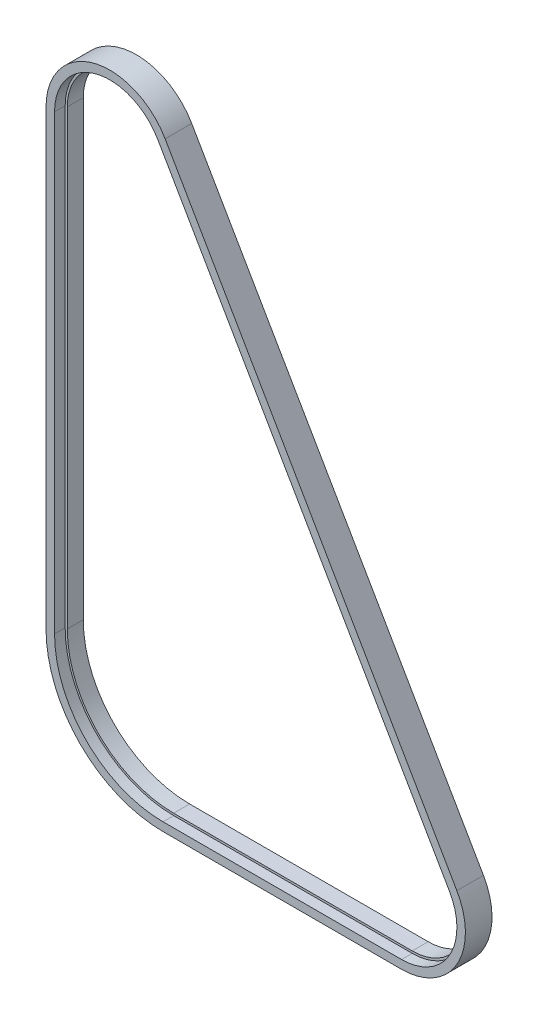
ISO-10303-21;
HEADER;
FILE_DESCRIPTION(('STEP AP214'),'2;1');
FILE_NAME('part.step','',(''),(''),'','','');
FILE_SCHEMA(('AUTOMOTIVE_DESIGN { 1 0 10303 214 1 1 1 1 }'));
ENDSEC;
DATA;
#1=APPLICATION_CONTEXT('core data for automotive mechanical design processes');
#2=APPLICATION_PROTOCOL_DEFINITION('international standard','automotive_design',2000,#1);
#3=PRODUCT_CONTEXT('',#1,'mechanical');
#4=PRODUCT('Part','Part','',(#3));
#5=PRODUCT_RELATED_PRODUCT_CATEGORY('part','',(#4));
#6=PRODUCT_DEFINITION_FORMATION('','',#4);
#7=PRODUCT_DEFINITION_CONTEXT('part definition',#1,'design');
#8=PRODUCT_DEFINITION('design','',#6,#7);
#9=PRODUCT_DEFINITION_SHAPE('','',#8);
#10=(LENGTH_UNIT() NAMED_UNIT(*) SI_UNIT(.MILLI.,.METRE.));
#11=(NAMED_UNIT(*) PLANE_ANGLE_UNIT() SI_UNIT($,.RADIAN.));
#12=(NAMED_UNIT(*) SI_UNIT($,.STERADIAN.) SOLID_ANGLE_UNIT());
#13=UNCERTAINTY_MEASURE_WITH_UNIT(LENGTH_MEASURE(1.E-05),#10,'distance_accuracy_value','');
#14=(GEOMETRIC_REPRESENTATION_CONTEXT(3) GLOBAL_UNCERTAINTY_ASSIGNED_CONTEXT((#13)) GLOBAL_UNIT_ASSIGNED_CONTEXT((#10,
#11,#12)) REPRESENTATION_CONTEXT('',''));
#15=CARTESIAN_POINT('',(0.,0.,0.));
#16=DIRECTION('',(0.,0.,1.));
#17=DIRECTION('',(1.,0.,0.));
#18=AXIS2_PLACEMENT_3D('',#15,#16,#17);
#19=CARTESIAN_POINT('',(-50.,525.,0.));
#20=DIRECTION('',(0.,0.,1.));
#21=DIRECTION('',(-1.,0.,0.));
#22=AXIS2_PLACEMENT_3D('',#19,#20,#21);
#23=PLANE('',#22);
#24=CARTESIAN_POINT('',(-50.,525.,0.));
#25=DIRECTION('',(0.,0.,1.));
#26=DIRECTION('',(-1.,0.,0.));
#27=AXIS2_PLACEMENT_3D('',#24,#25,#26);
#28=CIRCLE('',#27,60.);
#29=CARTESIAN_POINT('',(1.96152422706617,555.,0.));
#30=VERTEX_POINT('',#29);
#31=CARTESIAN_POINT('',(-110.,525.,0.));
#32=VERTEX_POINT('',#31);
#33=EDGE_CURVE('E239',#30,#32,#28,.T.);
#34=ORIENTED_EDGE('',*,*,#33,.T.);
#35=DIRECTION('',(0.,-1.,0.));
#36=VECTOR('',#35,1.);
#37=CARTESIAN_POINT('',(-110.,100.,0.));
#38=LINE('',#37,#36);
#39=CARTESIAN_POINT('',(-110.,100.,0.));
#40=VERTEX_POINT('',#39);
#41=EDGE_CURVE('E262',#32,#40,#38,.T.);
#42=ORIENTED_EDGE('',*,*,#41,.T.);
#43=CARTESIAN_POINT('',(0.,100.,0.));
#44=DIRECTION('',(0.,0.,1.));
#45=DIRECTION('',(1.,0.,0.));
#46=AXIS2_PLACEMENT_3D('',#43,#44,#45);
#47=CIRCLE('',#46,110.);
#48=CARTESIAN_POINT('',(0.,-10.,0.));
#49=VERTEX_POINT('',#48);
#50=EDGE_CURVE('E265',#40,#49,#47,.T.);
#51=ORIENTED_EDGE('',*,*,#50,.T.);
#52=DIRECTION('',(1.,0.,0.));
#53=VECTOR('',#52,1.);
#54=CARTESIAN_POINT('',(224.241377865075,-10.0000000000001,0.));
#55=LINE('',#54,#53);
#56=CARTESIAN_POINT('',(224.241377865075,-10.0000000000001,0.));
#57=VERTEX_POINT('',#56);
#58=EDGE_CURVE('E268',#49,#57,#55,.T.);
#59=ORIENTED_EDGE('',*,*,#58,.T.);
#60=CARTESIAN_POINT('',(224.241377865075,49.9999999999999,0.));
#61=DIRECTION('',(0.,0.,1.));
#62=DIRECTION('',(-1.,0.,0.));
#63=AXIS2_PLACEMENT_3D('',#60,#61,#62);
#64=CIRCLE('',#63,60.);
#65=CARTESIAN_POINT('',(276.202902092142,80.0000000000001,0.));
#66=VERTEX_POINT('',#65);
#67=EDGE_CURVE('E271',#57,#66,#64,.T.);
#68=ORIENTED_EDGE('',*,*,#67,.T.);
#69=DIRECTION('',(-0.500000000000004,0.866025403784436,0.));
#70=VECTOR('',#69,1.);
#71=CARTESIAN_POINT('',(1.96152422706617,555.,0.));
#72=LINE('',#71,#70);
#73=EDGE_CURVE('E244',#66,#30,#72,.T.);
#74=ORIENTED_EDGE('',*,*,#73,.T.);
#75=EDGE_LOOP('',(#34,#42,#51,#59,#68,#74));
#76=FACE_BOUND('',#75,.T.);
#77=DIRECTION('',(-0.500000000000004,0.866025403784436,0.));
#78=VECTOR('',#77,1.);
#79=CARTESIAN_POINT('',(269.274698861866,76.0000000000001,0.));
#80=LINE('',#79,#78);
#81=CARTESIAN_POINT('',(269.274698861866,76.0000000000001,0.));
#82=VERTEX_POINT('',#81);
#83=CARTESIAN_POINT('',(-4.96667900320927,551.,0.));
#84=VERTEX_POINT('',#83);
#85=EDGE_CURVE('E179',#82,#84,#80,.T.);
#86=ORIENTED_EDGE('',*,*,#85,.F.);
#87=CARTESIAN_POINT('',(224.241377865075,49.9999999999999,0.));
#88=DIRECTION('',(0.,0.,1.));
#89=DIRECTION('',(1.,0.,0.));
#90=AXIS2_PLACEMENT_3D('',#87,#88,#89);
#91=CIRCLE('',#90,52.);
#92=CARTESIAN_POINT('',(224.241377865075,-2.00000000000007,0.));
#93=VERTEX_POINT('',#92);
#94=EDGE_CURVE('E512',#93,#82,#91,.T.);
#95=ORIENTED_EDGE('',*,*,#94,.F.);
#96=DIRECTION('',(1.,0.,0.));
#97=VECTOR('',#96,1.);
#98=CARTESIAN_POINT('',(0.,-2.00000000000003,0.));
#99=LINE('',#98,#97);
#100=CARTESIAN_POINT('',(0.,-2.00000000000003,0.));
#101=VERTEX_POINT('',#100);
#102=EDGE_CURVE('E514',#101,#93,#99,.T.);
#103=ORIENTED_EDGE('',*,*,#102,.F.);
#104=CARTESIAN_POINT('',(0.,100.,0.));
#105=DIRECTION('',(0.,0.,1.));
#106=DIRECTION('',(1.,0.,0.));
#107=AXIS2_PLACEMENT_3D('',#104,#105,#106);
#108=CIRCLE('',#107,102.);
#109=CARTESIAN_POINT('',(-102.,100.,0.));
#110=VERTEX_POINT('',#109);
#111=EDGE_CURVE('E529',#110,#101,#108,.T.);
#112=ORIENTED_EDGE('',*,*,#111,.F.);
#113=DIRECTION('',(0.,-1.,0.));
#114=VECTOR('',#113,1.);
#115=CARTESIAN_POINT('',(-102.,525.,0.));
#116=LINE('',#115,#114);
#117=CARTESIAN_POINT('',(-102.,525.,0.));
#118=VERTEX_POINT('',#117);
#119=EDGE_CURVE('E530',#118,#110,#116,.T.);
#120=ORIENTED_EDGE('',*,*,#119,.F.);
#121=CARTESIAN_POINT('',(-50.,525.,0.));
#122=DIRECTION('',(0.,0.,1.));
#123=DIRECTION('',(1.,0.,0.));
#124=AXIS2_PLACEMENT_3D('',#121,#122,#123);
#125=CIRCLE('',#124,52.);
#126=EDGE_CURVE('E182',#84,#118,#125,.T.);
#127=ORIENTED_EDGE('',*,*,#126,.F.);
#128=EDGE_LOOP('',(#86,#95,#103,#112,#120,#127));
#129=FACE_BOUND('',#128,.T.);
#130=ADVANCED_FACE('F39',(#76,#129),#23,.T.);
#131=CARTESIAN_POINT('',(-50.,525.,-25.));
#132=DIRECTION('',(0.,0.,1.));
#133=DIRECTION('',(-1.,0.,0.));
#134=AXIS2_PLACEMENT_3D('',#131,#132,#133);
#135=PLANE('',#134);
#136=CARTESIAN_POINT('',(-50.,525.,-25.));
#137=DIRECTION('',(0.,0.,1.));
#138=DIRECTION('',(-1.,0.,0.));
#139=AXIS2_PLACEMENT_3D('',#136,#137,#138);
#140=CIRCLE('',#139,60.);
#141=CARTESIAN_POINT('',(1.96152422706617,555.,-25.));
#142=VERTEX_POINT('',#141);
#143=CARTESIAN_POINT('',(-110.,525.,-25.));
#144=VERTEX_POINT('',#143);
#145=EDGE_CURVE('E240',#142,#144,#140,.T.);
#146=ORIENTED_EDGE('',*,*,#145,.F.);
#147=DIRECTION('',(-0.500000000000004,0.866025403784436,0.));
#148=VECTOR('',#147,1.);
#149=CARTESIAN_POINT('',(1.96152422706617,555.,-25.));
#150=LINE('',#149,#148);
#151=CARTESIAN_POINT('',(276.202902092142,80.0000000000001,-25.));
#152=VERTEX_POINT('',#151);
#153=EDGE_CURVE('E256',#152,#142,#150,.T.);
#154=ORIENTED_EDGE('',*,*,#153,.F.);
#155=CARTESIAN_POINT('',(224.241377865075,49.9999999999999,-25.));
#156=DIRECTION('',(0.,0.,1.));
#157=DIRECTION('',(-1.,0.,0.));
#158=AXIS2_PLACEMENT_3D('',#155,#156,#157);
#159=CIRCLE('',#158,60.);
#160=CARTESIAN_POINT('',(224.241377865075,-10.0000000000001,-25.));
#161=VERTEX_POINT('',#160);
#162=EDGE_CURVE('E253',#161,#152,#159,.T.);
#163=ORIENTED_EDGE('',*,*,#162,.F.);
#164=DIRECTION('',(1.,0.,0.));
#165=VECTOR('',#164,1.);
#166=CARTESIAN_POINT('',(224.241377865075,-10.0000000000001,-25.));
#167=LINE('',#166,#165);
#168=CARTESIAN_POINT('',(0.,-10.,-25.));
#169=VERTEX_POINT('',#168);
#170=EDGE_CURVE('E250',#169,#161,#167,.T.);
#171=ORIENTED_EDGE('',*,*,#170,.F.);
#172=CARTESIAN_POINT('',(0.,100.,-25.));
#173=DIRECTION('',(0.,0.,1.));
#174=DIRECTION('',(1.,0.,0.));
#175=AXIS2_PLACEMENT_3D('',#172,#173,#174);
#176=CIRCLE('',#175,110.);
#177=CARTESIAN_POINT('',(-110.,100.,-25.));
#178=VERTEX_POINT('',#177);
#179=EDGE_CURVE('E247',#178,#169,#176,.T.);
#180=ORIENTED_EDGE('',*,*,#179,.F.);
#181=DIRECTION('',(0.,-1.,0.));
#182=VECTOR('',#181,1.);
#183=CARTESIAN_POINT('',(-110.,100.,-25.));
#184=LINE('',#183,#182);
#185=EDGE_CURVE('E243',#144,#178,#184,.T.);
#186=ORIENTED_EDGE('',*,*,#185,.F.);
#187=EDGE_LOOP('',(#146,#154,#163,#171,#180,#186));
#188=FACE_BOUND('',#187,.T.);
#189=CARTESIAN_POINT('',(0.,100.,-25.));
#190=DIRECTION('',(0.,0.,1.));
#191=DIRECTION('',(1.,0.,0.));
#192=AXIS2_PLACEMENT_3D('',#189,#190,#191);
#193=CIRCLE('',#192,100.);
#194=CARTESIAN_POINT('',(-100.,100.,-25.));
#195=VERTEX_POINT('',#194);
#196=CARTESIAN_POINT('',(0.,0.,-25.));
#197=VERTEX_POINT('',#196);
#198=EDGE_CURVE('E204',#195,#197,#193,.T.);
#199=ORIENTED_EDGE('',*,*,#198,.T.);
#200=DIRECTION('',(1.,0.,0.));
#201=VECTOR('',#200,1.);
#202=CARTESIAN_POINT('',(224.241377865075,0.,-25.));
#203=LINE('',#202,#201);
#204=CARTESIAN_POINT('',(224.241377865075,0.,-25.));
#205=VERTEX_POINT('',#204);
#206=EDGE_CURVE('E207',#197,#205,#203,.T.);
#207=ORIENTED_EDGE('',*,*,#206,.T.);
#208=CARTESIAN_POINT('',(224.241377865075,49.9999999999999,-25.));
#209=DIRECTION('',(0.,0.,1.));
#210=DIRECTION('',(-1.,0.,0.));
#211=AXIS2_PLACEMENT_3D('',#208,#209,#210);
#212=CIRCLE('',#211,50.);
#213=CARTESIAN_POINT('',(267.542648054297,75.0000000000002,-25.));
#214=VERTEX_POINT('',#213);
#215=EDGE_CURVE('E210',#205,#214,#212,.T.);
#216=ORIENTED_EDGE('',*,*,#215,.T.);
#217=DIRECTION('',(-0.500000000000004,0.866025403784436,0.));
#218=VECTOR('',#217,1.);
#219=CARTESIAN_POINT('',(-6.69872981077817,550.,-25.));
#220=LINE('',#219,#218);
#221=CARTESIAN_POINT('',(-6.69872981077816,550.,-25.));
#222=VERTEX_POINT('',#221);
#223=EDGE_CURVE('E213',#214,#222,#220,.T.);
#224=ORIENTED_EDGE('',*,*,#223,.T.);
#225=CARTESIAN_POINT('',(-50.,525.,-25.));
#226=DIRECTION('',(0.,0.,1.));
#227=DIRECTION('',(-1.,0.,0.));
#228=AXIS2_PLACEMENT_3D('',#225,#226,#227);
#229=CIRCLE('',#228,50.);
#230=CARTESIAN_POINT('',(-100.,525.,-25.));
#231=VERTEX_POINT('',#230);
#232=EDGE_CURVE('E216',#222,#231,#229,.T.);
#233=ORIENTED_EDGE('',*,*,#232,.T.);
#234=DIRECTION('',(0.,-1.,0.));
#235=VECTOR('',#234,1.);
#236=CARTESIAN_POINT('',(-100.,100.,-25.));
#237=LINE('',#236,#235);
#238=EDGE_CURVE('E219',#231,#195,#237,.T.);
#239=ORIENTED_EDGE('',*,*,#238,.T.);
#240=EDGE_LOOP('',(#199,#207,#216,#224,#233,#239));
#241=FACE_BOUND('',#240,.T.);
#242=ADVANCED_FACE('F301',(#188,#241),#135,.F.);
#243=CARTESIAN_POINT('',(-50.,525.,-25.));
#244=DIRECTION('',(0.,0.,1.));
#245=DIRECTION('',(-1.,0.,0.));
#246=AXIS2_PLACEMENT_3D('',#243,#244,#245);
#247=CYLINDRICAL_SURFACE('',#246,60.);
#248=ORIENTED_EDGE('',*,*,#33,.F.);
#249=DIRECTION('',(0.,0.,1.));
#250=VECTOR('',#249,1.);
#251=CARTESIAN_POINT('',(1.96152422706617,555.,-25.));
#252=LINE('',#251,#250);
#253=EDGE_CURVE('E259',#142,#30,#252,.T.);
#254=ORIENTED_EDGE('',*,*,#253,.F.);
#255=ORIENTED_EDGE('',*,*,#145,.T.);
#256=DIRECTION('',(0.,0.,1.));
#257=VECTOR('',#256,1.);
#258=CARTESIAN_POINT('',(-110.,525.,-25.));
#259=LINE('',#258,#257);
#260=EDGE_CURVE('E47',#144,#32,#259,.T.);
#261=ORIENTED_EDGE('',*,*,#260,.T.);
#262=EDGE_LOOP('',(#248,#254,#255,#261));
#263=FACE_BOUND('',#262,.T.);
#264=ADVANCED_FACE('F41',(#263),#247,.T.);
#265=CARTESIAN_POINT('',(-110.,100.,-25.));
#266=DIRECTION('',(1.,0.,0.));
#267=DIRECTION('',(0.,1.,0.));
#268=AXIS2_PLACEMENT_3D('',#265,#266,#267);
#269=PLANE('',#268);
#270=ORIENTED_EDGE('',*,*,#41,.F.);
#271=ORIENTED_EDGE('',*,*,#260,.F.);
#272=ORIENTED_EDGE('',*,*,#185,.T.);
#273=DIRECTION('',(0.,0.,1.));
#274=VECTOR('',#273,1.);
#275=CARTESIAN_POINT('',(-110.,100.,-25.));
#276=LINE('',#275,#274);
#277=EDGE_CURVE('E283',#178,#40,#276,.T.);
#278=ORIENTED_EDGE('',*,*,#277,.T.);
#279=EDGE_LOOP('',(#270,#271,#272,#278));
#280=FACE_BOUND('',#279,.T.);
#281=ADVANCED_FACE('F290',(#280),#269,.F.);
#282=CARTESIAN_POINT('',(0.,100.,-25.));
#283=DIRECTION('',(0.,0.,1.));
#284=DIRECTION('',(-1.,0.,0.));
#285=AXIS2_PLACEMENT_3D('',#282,#283,#284);
#286=CYLINDRICAL_SURFACE('',#285,110.);
#287=ORIENTED_EDGE('',*,*,#50,.F.);
#288=ORIENTED_EDGE('',*,*,#277,.F.);
#289=ORIENTED_EDGE('',*,*,#179,.T.);
#290=DIRECTION('',(0.,0.,1.));
#291=VECTOR('',#290,1.);
#292=CARTESIAN_POINT('',(0.,-10.,-25.));
#293=LINE('',#292,#291);
#294=EDGE_CURVE('E281',#169,#49,#293,.T.);
#295=ORIENTED_EDGE('',*,*,#294,.T.);
#296=EDGE_LOOP('',(#287,#288,#289,#295));
#297=FACE_BOUND('',#296,.T.);
#298=ADVANCED_FACE('F306',(#297),#286,.T.);
#299=CARTESIAN_POINT('',(224.241377865075,-10.0000000000001,-25.));
#300=DIRECTION('',(0.,1.,0.));
#301=DIRECTION('',(-1.,0.,0.));
#302=AXIS2_PLACEMENT_3D('',#299,#300,#301);
#303=PLANE('',#302);
#304=ORIENTED_EDGE('',*,*,#58,.F.);
#305=ORIENTED_EDGE('',*,*,#294,.F.);
#306=ORIENTED_EDGE('',*,*,#170,.T.);
#307=DIRECTION('',(0.,0.,1.));
#308=VECTOR('',#307,1.);
#309=CARTESIAN_POINT('',(224.241377865075,-10.0000000000001,-25.));
#310=LINE('',#309,#308);
#311=EDGE_CURVE('E279',#161,#57,#310,.T.);
#312=ORIENTED_EDGE('',*,*,#311,.T.);
#313=EDGE_LOOP('',(#304,#305,#306,#312));
#314=FACE_BOUND('',#313,.T.);
#315=ADVANCED_FACE('F309',(#314),#303,.F.);
#316=CARTESIAN_POINT('',(224.241377865075,49.9999999999999,-25.));
#317=DIRECTION('',(0.,0.,1.));
#318=DIRECTION('',(-1.,0.,0.));
#319=AXIS2_PLACEMENT_3D('',#316,#317,#318);
#320=CYLINDRICAL_SURFACE('',#319,60.);
#321=ORIENTED_EDGE('',*,*,#67,.F.);
#322=ORIENTED_EDGE('',*,*,#311,.F.);
#323=ORIENTED_EDGE('',*,*,#162,.T.);
#324=DIRECTION('',(0.,0.,1.));
#325=VECTOR('',#324,1.);
#326=CARTESIAN_POINT('',(276.202902092142,80.0000000000001,-25.));
#327=LINE('',#326,#325);
#328=EDGE_CURVE('E277',#152,#66,#327,.T.);
#329=ORIENTED_EDGE('',*,*,#328,.T.);
#330=EDGE_LOOP('',(#321,#322,#323,#329));
#331=FACE_BOUND('',#330,.T.);
#332=ADVANCED_FACE('F311',(#331),#320,.T.);
#333=CARTESIAN_POINT('',(1.96152422706617,555.,-25.));
#334=DIRECTION('',(-0.866025403784436,-0.500000000000004,0.));
#335=DIRECTION('',(0.500000000000004,-0.866025403784436,0.));
#336=AXIS2_PLACEMENT_3D('',#333,#334,#335);
#337=PLANE('',#336);
#338=ORIENTED_EDGE('',*,*,#73,.F.);
#339=ORIENTED_EDGE('',*,*,#328,.F.);
#340=ORIENTED_EDGE('',*,*,#153,.T.);
#341=ORIENTED_EDGE('',*,*,#253,.T.);
#342=EDGE_LOOP('',(#338,#339,#340,#341));
#343=FACE_BOUND('',#342,.T.);
#344=ADVANCED_FACE('F297',(#343),#337,.F.);
#345=CARTESIAN_POINT('',(0.,100.,-25.));
#346=DIRECTION('',(0.,0.,1.));
#347=DIRECTION('',(-1.,0.,0.));
#348=AXIS2_PLACEMENT_3D('',#345,#346,#347);
#349=CYLINDRICAL_SURFACE('',#348,100.);
#350=CARTESIAN_POINT('',(0.,100.,-10.));
#351=DIRECTION('',(0.,0.,1.));
#352=DIRECTION('',(1.,0.,0.));
#353=AXIS2_PLACEMENT_3D('',#350,#351,#352);
#354=CIRCLE('',#353,100.);
#355=CARTESIAN_POINT('',(-100.,100.,-10.));
#356=VERTEX_POINT('',#355);
#357=CARTESIAN_POINT('',(0.,0.,-10.));
#358=VERTEX_POINT('',#357);
#359=EDGE_CURVE('E201',#356,#358,#354,.T.);
#360=ORIENTED_EDGE('',*,*,#359,.T.);
#361=DIRECTION('',(0.,0.,1.));
#362=VECTOR('',#361,1.);
#363=CARTESIAN_POINT('',(0.,0.,-25.));
#364=LINE('',#363,#362);
#365=EDGE_CURVE('E236',#197,#358,#364,.T.);
#366=ORIENTED_EDGE('',*,*,#365,.F.);
#367=ORIENTED_EDGE('',*,*,#198,.F.);
#368=DIRECTION('',(0.,0.,1.));
#369=VECTOR('',#368,1.);
#370=CARTESIAN_POINT('',(-100.,100.,-25.));
#371=LINE('',#370,#369);
#372=EDGE_CURVE('E222',#195,#356,#371,.T.);
#373=ORIENTED_EDGE('',*,*,#372,.T.);
#374=EDGE_LOOP('',(#360,#366,#367,#373));
#375=FACE_BOUND('',#374,.T.);
#376=ADVANCED_FACE('F318',(#375),#349,.F.);
#377=CARTESIAN_POINT('',(224.241377865075,0.,-25.));
#378=DIRECTION('',(0.,1.,0.));
#379=DIRECTION('',(0.,0.,-1.));
#380=AXIS2_PLACEMENT_3D('',#377,#378,#379);
#381=PLANE('',#380);
#382=DIRECTION('',(1.,0.,0.));
#383=VECTOR('',#382,1.);
#384=CARTESIAN_POINT('',(224.241377865075,0.,-10.));
#385=LINE('',#384,#383);
#386=CARTESIAN_POINT('',(224.241377865075,0.,-10.));
#387=VERTEX_POINT('',#386);
#388=EDGE_CURVE('E198',#358,#387,#385,.T.);
#389=ORIENTED_EDGE('',*,*,#388,.T.);
#390=DIRECTION('',(0.,0.,1.));
#391=VECTOR('',#390,1.);
#392=CARTESIAN_POINT('',(224.241377865075,0.,-25.));
#393=LINE('',#392,#391);
#394=EDGE_CURVE('E233',#205,#387,#393,.T.);
#395=ORIENTED_EDGE('',*,*,#394,.F.);
#396=ORIENTED_EDGE('',*,*,#206,.F.);
#397=ORIENTED_EDGE('',*,*,#365,.T.);
#398=EDGE_LOOP('',(#389,#395,#396,#397));
#399=FACE_BOUND('',#398,.T.);
#400=ADVANCED_FACE('F330',(#399),#381,.T.);
#401=CARTESIAN_POINT('',(224.241377865075,49.9999999999999,-25.));
#402=DIRECTION('',(0.,0.,1.));
#403=DIRECTION('',(-1.,0.,0.));
#404=AXIS2_PLACEMENT_3D('',#401,#402,#403);
#405=CYLINDRICAL_SURFACE('',#404,50.);
#406=CARTESIAN_POINT('',(224.241377865075,49.9999999999999,-10.));
#407=DIRECTION('',(0.,0.,1.));
#408=DIRECTION('',(1.,0.,0.));
#409=AXIS2_PLACEMENT_3D('',#406,#407,#408);
#410=CIRCLE('',#409,50.);
#411=CARTESIAN_POINT('',(267.542648054297,75.0000000000002,-10.));
#412=VERTEX_POINT('',#411);
#413=EDGE_CURVE('E195',#387,#412,#410,.T.);
#414=ORIENTED_EDGE('',*,*,#413,.T.);
#415=DIRECTION('',(0.,0.,1.));
#416=VECTOR('',#415,1.);
#417=CARTESIAN_POINT('',(267.542648054297,75.0000000000002,-25.));
#418=LINE('',#417,#416);
#419=EDGE_CURVE('E230',#214,#412,#418,.T.);
#420=ORIENTED_EDGE('',*,*,#419,.F.);
#421=ORIENTED_EDGE('',*,*,#215,.F.);
#422=ORIENTED_EDGE('',*,*,#394,.T.);
#423=EDGE_LOOP('',(#414,#420,#421,#422));
#424=FACE_BOUND('',#423,.T.);
#425=ADVANCED_FACE('F334',(#424),#405,.F.);
#426=CARTESIAN_POINT('',(-6.69872981077817,550.,-25.));
#427=DIRECTION('',(-0.866025403784436,-0.500000000000004,0.));
#428=DIRECTION('',(0.500000000000004,-0.866025403784436,0.));
#429=AXIS2_PLACEMENT_3D('',#426,#427,#428);
#430=PLANE('',#429);
#431=DIRECTION('',(-0.500000000000004,0.866025403784436,0.));
#432=VECTOR('',#431,1.);
#433=CARTESIAN_POINT('',(-6.69872981077817,550.,-10.));
#434=LINE('',#433,#432);
#435=CARTESIAN_POINT('',(-6.69872981077816,550.,-10.));
#436=VERTEX_POINT('',#435);
#437=EDGE_CURVE('E187',#412,#436,#434,.T.);
#438=ORIENTED_EDGE('',*,*,#437,.T.);
#439=DIRECTION('',(0.,0.,1.));
#440=VECTOR('',#439,1.);
#441=CARTESIAN_POINT('',(-6.69872981077816,550.,-25.));
#442=LINE('',#441,#440);
#443=EDGE_CURVE('E227',#222,#436,#442,.T.);
#444=ORIENTED_EDGE('',*,*,#443,.F.);
#445=ORIENTED_EDGE('',*,*,#223,.F.);
#446=ORIENTED_EDGE('',*,*,#419,.T.);
#447=EDGE_LOOP('',(#438,#444,#445,#446));
#448=FACE_BOUND('',#447,.T.);
#449=ADVANCED_FACE('F338',(#448),#430,.T.);
#450=CARTESIAN_POINT('',(-50.,525.,-25.));
#451=DIRECTION('',(0.,0.,1.));
#452=DIRECTION('',(-1.,0.,0.));
#453=AXIS2_PLACEMENT_3D('',#450,#451,#452);
#454=CYLINDRICAL_SURFACE('',#453,50.);
#455=CARTESIAN_POINT('',(-50.,525.,-10.));
#456=DIRECTION('',(0.,0.,1.));
#457=DIRECTION('',(1.,0.,0.));
#458=AXIS2_PLACEMENT_3D('',#455,#456,#457);
#459=CIRCLE('',#458,50.);
#460=CARTESIAN_POINT('',(-100.,525.,-10.));
#461=VERTEX_POINT('',#460);
#462=EDGE_CURVE('E184',#436,#461,#459,.T.);
#463=ORIENTED_EDGE('',*,*,#462,.T.);
#464=DIRECTION('',(0.,0.,1.));
#465=VECTOR('',#464,1.);
#466=CARTESIAN_POINT('',(-100.,525.,-25.));
#467=LINE('',#466,#465);
#468=EDGE_CURVE('E225',#231,#461,#467,.T.);
#469=ORIENTED_EDGE('',*,*,#468,.F.);
#470=ORIENTED_EDGE('',*,*,#232,.F.);
#471=ORIENTED_EDGE('',*,*,#443,.T.);
#472=EDGE_LOOP('',(#463,#469,#470,#471));
#473=FACE_BOUND('',#472,.T.);
#474=ADVANCED_FACE('F342',(#473),#454,.F.);
#475=CARTESIAN_POINT('',(-100.,100.,-25.));
#476=DIRECTION('',(1.,0.,0.));
#477=DIRECTION('',(0.,0.,1.));
#478=AXIS2_PLACEMENT_3D('',#475,#476,#477);
#479=PLANE('',#478);
#480=DIRECTION('',(0.,-1.,0.));
#481=VECTOR('',#480,1.);
#482=CARTESIAN_POINT('',(-100.,100.,-10.));
#483=LINE('',#482,#481);
#484=EDGE_CURVE('E11',#461,#356,#483,.T.);
#485=ORIENTED_EDGE('',*,*,#484,.T.);
#486=ORIENTED_EDGE('',*,*,#372,.F.);
#487=ORIENTED_EDGE('',*,*,#238,.F.);
#488=ORIENTED_EDGE('',*,*,#468,.T.);
#489=EDGE_LOOP('',(#485,#486,#487,#488));
#490=FACE_BOUND('',#489,.T.);
#491=ADVANCED_FACE('F346',(#490),#479,.T.);
#492=CARTESIAN_POINT('',(-50.,525.,-10.));
#493=DIRECTION('',(0.,0.,1.));
#494=DIRECTION('',(-1.,0.,0.));
#495=AXIS2_PLACEMENT_3D('',#492,#493,#494);
#496=CYLINDRICAL_SURFACE('',#495,52.);
#497=ORIENTED_EDGE('',*,*,#126,.T.);
#498=DIRECTION('',(0.,0.,1.));
#499=VECTOR('',#498,1.);
#500=CARTESIAN_POINT('',(-102.,525.,-10.));
#501=LINE('',#500,#499);
#502=CARTESIAN_POINT('',(-102.,525.,-10.));
#503=VERTEX_POINT('',#502);
#504=EDGE_CURVE('E169',#503,#118,#501,.T.);
#505=ORIENTED_EDGE('',*,*,#504,.F.);
#506=CARTESIAN_POINT('',(-50.,525.,-10.));
#507=DIRECTION('',(0.,0.,1.));
#508=DIRECTION('',(1.,0.,0.));
#509=AXIS2_PLACEMENT_3D('',#506,#507,#508);
#510=CIRCLE('',#509,52.);
#511=CARTESIAN_POINT('',(-4.96667900320928,551.,-10.));
#512=VERTEX_POINT('',#511);
#513=EDGE_CURVE('E174',#512,#503,#510,.T.);
#514=ORIENTED_EDGE('',*,*,#513,.F.);
#515=DIRECTION('',(0.,0.,1.));
#516=VECTOR('',#515,1.);
#517=CARTESIAN_POINT('',(-4.96667900320928,551.,-10.));
#518=LINE('',#517,#516);
#519=EDGE_CURVE('E54',#512,#84,#518,.T.);
#520=ORIENTED_EDGE('',*,*,#519,.T.);
#521=EDGE_LOOP('',(#497,#505,#514,#520));
#522=FACE_BOUND('',#521,.T.);
#523=ADVANCED_FACE('F181',(#522),#496,.F.);
#524=CARTESIAN_POINT('',(-102.,525.,-10.));
#525=DIRECTION('',(1.,0.,0.));
#526=DIRECTION('',(0.,0.,1.));
#527=AXIS2_PLACEMENT_3D('',#524,#525,#526);
#528=PLANE('',#527);
#529=ORIENTED_EDGE('',*,*,#119,.T.);
#530=DIRECTION('',(0.,0.,1.));
#531=VECTOR('',#530,1.);
#532=CARTESIAN_POINT('',(-102.,100.,-10.));
#533=LINE('',#532,#531);
#534=CARTESIAN_POINT('',(-102.,100.,-10.));
#535=VERTEX_POINT('',#534);
#536=EDGE_CURVE('E170',#535,#110,#533,.T.);
#537=ORIENTED_EDGE('',*,*,#536,.F.);
#538=DIRECTION('',(0.,-1.,0.));
#539=VECTOR('',#538,1.);
#540=CARTESIAN_POINT('',(-102.,525.,-10.));
#541=LINE('',#540,#539);
#542=EDGE_CURVE('E164',#503,#535,#541,.T.);
#543=ORIENTED_EDGE('',*,*,#542,.F.);
#544=ORIENTED_EDGE('',*,*,#504,.T.);
#545=EDGE_LOOP('',(#529,#537,#543,#544));
#546=FACE_BOUND('',#545,.T.);
#547=ADVANCED_FACE('F167',(#546),#528,.T.);
#548=CARTESIAN_POINT('',(0.,100.,-10.));
#549=DIRECTION('',(0.,0.,1.));
#550=DIRECTION('',(-1.,0.,0.));
#551=AXIS2_PLACEMENT_3D('',#548,#549,#550);
#552=CYLINDRICAL_SURFACE('',#551,102.);
#553=ORIENTED_EDGE('',*,*,#111,.T.);
#554=DIRECTION('',(0.,0.,1.));
#555=VECTOR('',#554,1.);
#556=CARTESIAN_POINT('',(0.,-2.00000000000003,-10.));
#557=LINE('',#556,#555);
#558=CARTESIAN_POINT('',(0.,-2.00000000000003,-10.));
#559=VERTEX_POINT('',#558);
#560=EDGE_CURVE('E189',#559,#101,#557,.T.);
#561=ORIENTED_EDGE('',*,*,#560,.F.);
#562=CARTESIAN_POINT('',(0.,100.,-10.));
#563=DIRECTION('',(0.,0.,1.));
#564=DIRECTION('',(1.,0.,0.));
#565=AXIS2_PLACEMENT_3D('',#562,#563,#564);
#566=CIRCLE('',#565,102.);
#567=EDGE_CURVE('E173',#535,#559,#566,.T.);
#568=ORIENTED_EDGE('',*,*,#567,.F.);
#569=ORIENTED_EDGE('',*,*,#536,.T.);
#570=EDGE_LOOP('',(#553,#561,#568,#569));
#571=FACE_BOUND('',#570,.T.);
#572=ADVANCED_FACE('F355',(#571),#552,.F.);
#573=CARTESIAN_POINT('',(0.,-2.00000000000003,-10.));
#574=DIRECTION('',(0.,1.,0.));
#575=DIRECTION('',(-1.,0.,0.));
#576=AXIS2_PLACEMENT_3D('',#573,#574,#575);
#577=PLANE('',#576);
#578=ORIENTED_EDGE('',*,*,#102,.T.);
#579=DIRECTION('',(0.,0.,1.));
#580=VECTOR('',#579,1.);
#581=CARTESIAN_POINT('',(224.241377865075,-2.00000000000007,-10.));
#582=LINE('',#581,#580);
#583=CARTESIAN_POINT('',(224.241377865075,-2.00000000000007,-10.));
#584=VERTEX_POINT('',#583);
#585=EDGE_CURVE('E520',#584,#93,#582,.T.);
#586=ORIENTED_EDGE('',*,*,#585,.F.);
#587=DIRECTION('',(1.,0.,0.));
#588=VECTOR('',#587,1.);
#589=CARTESIAN_POINT('',(0.,-2.00000000000003,-10.));
#590=LINE('',#589,#588);
#591=EDGE_CURVE('E527',#559,#584,#590,.T.);
#592=ORIENTED_EDGE('',*,*,#591,.F.);
#593=ORIENTED_EDGE('',*,*,#560,.T.);
#594=EDGE_LOOP('',(#578,#586,#592,#593));
#595=FACE_BOUND('',#594,.T.);
#596=ADVANCED_FACE('F358',(#595),#577,.T.);
#597=CARTESIAN_POINT('',(224.241377865075,49.9999999999999,-10.));
#598=DIRECTION('',(0.,0.,1.));
#599=DIRECTION('',(-1.,0.,0.));
#600=AXIS2_PLACEMENT_3D('',#597,#598,#599);
#601=CYLINDRICAL_SURFACE('',#600,52.);
#602=ORIENTED_EDGE('',*,*,#94,.T.);
#603=DIRECTION('',(0.,0.,1.));
#604=VECTOR('',#603,1.);
#605=CARTESIAN_POINT('',(269.274698861866,76.0000000000001,-10.));
#606=LINE('',#605,#604);
#607=CARTESIAN_POINT('',(269.274698861866,76.0000000000001,-10.));
#608=VERTEX_POINT('',#607);
#609=EDGE_CURVE('E509',#608,#82,#606,.T.);
#610=ORIENTED_EDGE('',*,*,#609,.F.);
#611=CARTESIAN_POINT('',(224.241377865075,49.9999999999999,-10.));
#612=DIRECTION('',(0.,0.,1.));
#613=DIRECTION('',(1.,0.,0.));
#614=AXIS2_PLACEMENT_3D('',#611,#612,#613);
#615=CIRCLE('',#614,52.);
#616=EDGE_CURVE('E536',#584,#608,#615,.T.);
#617=ORIENTED_EDGE('',*,*,#616,.F.);
#618=ORIENTED_EDGE('',*,*,#585,.T.);
#619=EDGE_LOOP('',(#602,#610,#617,#618));
#620=FACE_BOUND('',#619,.T.);
#621=ADVANCED_FACE('F362',(#620),#601,.F.);
#622=CARTESIAN_POINT('',(269.274698861866,76.0000000000001,-10.));
#623=DIRECTION('',(-0.866025403784436,-0.500000000000004,0.));
#624=DIRECTION('',(0.500000000000004,-0.866025403784436,0.));
#625=AXIS2_PLACEMENT_3D('',#622,#623,#624);
#626=PLANE('',#625);
#627=ORIENTED_EDGE('',*,*,#85,.T.);
#628=ORIENTED_EDGE('',*,*,#519,.F.);
#629=DIRECTION('',(-0.500000000000004,0.866025403784436,0.));
#630=VECTOR('',#629,1.);
#631=CARTESIAN_POINT('',(269.274698861866,76.0000000000001,-10.));
#632=LINE('',#631,#630);
#633=EDGE_CURVE('E178',#608,#512,#632,.T.);
#634=ORIENTED_EDGE('',*,*,#633,.F.);
#635=ORIENTED_EDGE('',*,*,#609,.T.);
#636=EDGE_LOOP('',(#627,#628,#634,#635));
#637=FACE_BOUND('',#636,.T.);
#638=ADVANCED_FACE('F366',(#637),#626,.T.);
#639=CARTESIAN_POINT('',(-50.,525.,-10.));
#640=DIRECTION('',(0.,0.,-1.));
#641=DIRECTION('',(1.,0.,0.));
#642=AXIS2_PLACEMENT_3D('',#639,#640,#641);
#643=PLANE('',#642);
#644=ORIENTED_EDGE('',*,*,#359,.F.);
#645=ORIENTED_EDGE('',*,*,#484,.F.);
#646=ORIENTED_EDGE('',*,*,#462,.F.);
#647=ORIENTED_EDGE('',*,*,#437,.F.);
#648=ORIENTED_EDGE('',*,*,#413,.F.);
#649=ORIENTED_EDGE('',*,*,#388,.F.);
#650=EDGE_LOOP('',(#644,#645,#646,#647,#648,#649));
#651=FACE_BOUND('',#650,.T.);
#652=ORIENTED_EDGE('',*,*,#513,.T.);
#653=ORIENTED_EDGE('',*,*,#542,.T.);
#654=ORIENTED_EDGE('',*,*,#567,.T.);
#655=ORIENTED_EDGE('',*,*,#591,.T.);
#656=ORIENTED_EDGE('',*,*,#616,.T.);
#657=ORIENTED_EDGE('',*,*,#633,.T.);
#658=EDGE_LOOP('',(#652,#653,#654,#655,#656,#657));
#659=FACE_BOUND('',#658,.T.);
#660=ADVANCED_FACE('F176',(#651,#659),#643,.F.);
#661=CLOSED_SHELL('',(#130,#242,#264,#281,#298,#315,#332,#344,#376,#400,#425,#449,#474,#491,
#523,#547,#572,#596,#621,#638,#660));
#662=MANIFOLD_SOLID_BREP('B2',#661);
#663=ADVANCED_BREP_SHAPE_REPRESENTATION('',(#18,#662),#14);
#664=SHAPE_DEFINITION_REPRESENTATION(#9,#663);
ENDSEC;
END-ISO-10303-21;
